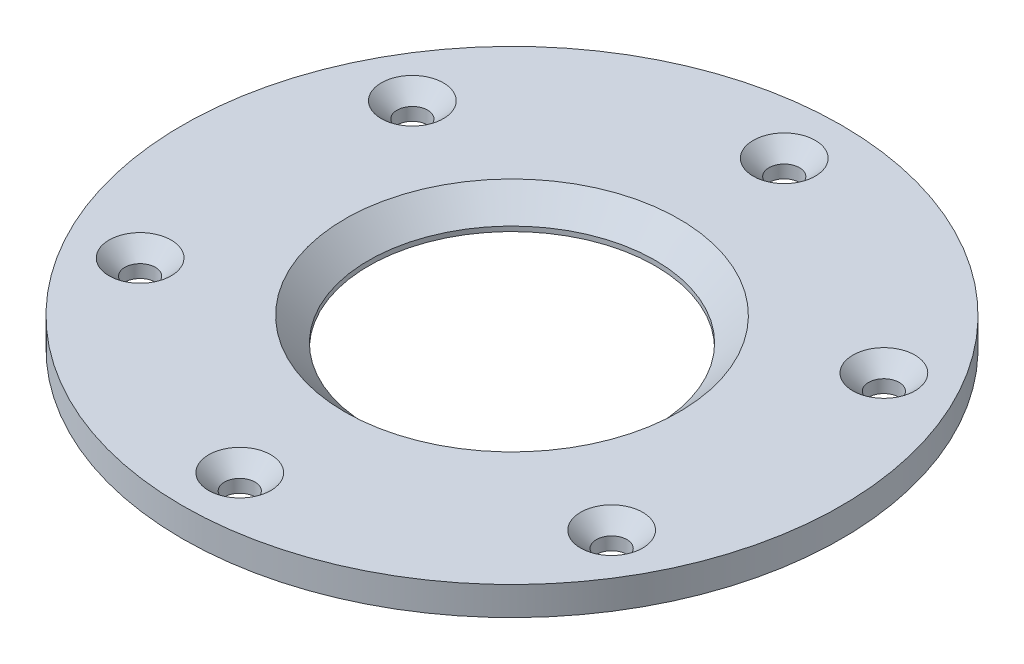
ISO-10303-21;
HEADER;
FILE_DESCRIPTION(('STEP AP214'),'2;1');
FILE_NAME('part.step','',(''),(''),'','','');
FILE_SCHEMA(('AUTOMOTIVE_DESIGN { 1 0 10303 214 1 1 1 1 }'));
ENDSEC;
DATA;
#1=APPLICATION_CONTEXT('core data for automotive mechanical design processes');
#2=APPLICATION_PROTOCOL_DEFINITION('international standard','automotive_design',2000,#1);
#3=PRODUCT_CONTEXT('',#1,'mechanical');
#4=PRODUCT('Part','Part','',(#3));
#5=PRODUCT_RELATED_PRODUCT_CATEGORY('part','',(#4));
#6=PRODUCT_DEFINITION_FORMATION('','',#4);
#7=PRODUCT_DEFINITION_CONTEXT('part definition',#1,'design');
#8=PRODUCT_DEFINITION('design','',#6,#7);
#9=PRODUCT_DEFINITION_SHAPE('','',#8);
#10=(LENGTH_UNIT() NAMED_UNIT(*) SI_UNIT(.MILLI.,.METRE.));
#11=(NAMED_UNIT(*) PLANE_ANGLE_UNIT() SI_UNIT($,.RADIAN.));
#12=(NAMED_UNIT(*) SI_UNIT($,.STERADIAN.) SOLID_ANGLE_UNIT());
#13=UNCERTAINTY_MEASURE_WITH_UNIT(LENGTH_MEASURE(1.E-05),#10,'distance_accuracy_value','');
#14=(GEOMETRIC_REPRESENTATION_CONTEXT(3) GLOBAL_UNCERTAINTY_ASSIGNED_CONTEXT((#13)) GLOBAL_UNIT_ASSIGNED_CONTEXT((#10,
#11,#12)) REPRESENTATION_CONTEXT('',''));
#15=CARTESIAN_POINT('',(0.,0.,0.));
#16=DIRECTION('',(0.,0.,1.));
#17=DIRECTION('',(1.,0.,0.));
#18=AXIS2_PLACEMENT_3D('',#15,#16,#17);
#19=CARTESIAN_POINT('',(0.,1.51000000000001,0.));
#20=DIRECTION('',(0.,1.,0.));
#21=DIRECTION('',(0.,0.,1.));
#22=AXIS2_PLACEMENT_3D('',#19,#20,#21);
#23=PLANE('',#22);
#24=CARTESIAN_POINT('',(0.,1.51000000000001,0.));
#25=DIRECTION('',(0.,1.,0.));
#26=DIRECTION('',(0.,0.,1.));
#27=AXIS2_PLACEMENT_3D('',#24,#25,#26);
#28=CIRCLE('',#27,17.5);
#29=CARTESIAN_POINT('',(0.,1.51000000000001,17.5));
#30=VERTEX_POINT('',#29);
#31=EDGE_CURVE('E20',#30,#30,#28,.F.);
#32=ORIENTED_EDGE('',*,*,#31,.F.);
#33=EDGE_LOOP('',(#32));
#34=FACE_BOUND('',#33,.T.);
#35=CARTESIAN_POINT('',(0.,1.51000000000001,0.));
#36=DIRECTION('',(0.,1.,0.));
#37=DIRECTION('',(0.,0.,1.));
#38=AXIS2_PLACEMENT_3D('',#35,#36,#37);
#39=CIRCLE('',#38,19.95);
#40=CARTESIAN_POINT('',(0.,1.51000000000001,19.95));
#41=VERTEX_POINT('',#40);
#42=EDGE_CURVE('E212',#41,#41,#39,.F.);
#43=ORIENTED_EDGE('',*,*,#42,.T.);
#44=EDGE_LOOP('',(#43));
#45=FACE_BOUND('',#44,.T.);
#46=ADVANCED_FACE('F17',(#34,#45),#23,.F.);
#47=CARTESIAN_POINT('',(0.,0.,0.));
#48=DIRECTION('',(0.,1.,0.));
#49=DIRECTION('',(0.,0.,1.));
#50=AXIS2_PLACEMENT_3D('',#47,#48,#49);
#51=CYLINDRICAL_SURFACE('',#50,17.5);
#52=CARTESIAN_POINT('',(0.,0.,0.));
#53=DIRECTION('',(0.,1.,0.));
#54=DIRECTION('',(0.,0.,1.));
#55=AXIS2_PLACEMENT_3D('',#52,#53,#54);
#56=CIRCLE('',#55,17.5);
#57=CARTESIAN_POINT('',(0.,0.,17.5));
#58=VERTEX_POINT('',#57);
#59=EDGE_CURVE('E208',#58,#58,#56,.F.);
#60=ORIENTED_EDGE('',*,*,#59,.F.);
#61=EDGE_LOOP('',(#60));
#62=FACE_BOUND('',#61,.T.);
#63=ORIENTED_EDGE('',*,*,#31,.T.);
#64=EDGE_LOOP('',(#63));
#65=FACE_BOUND('',#64,.T.);
#66=ADVANCED_FACE('F198',(#62,#65),#51,.T.);
#67=CARTESIAN_POINT('',(0.,0.,0.));
#68=DIRECTION('',(0.,1.,0.));
#69=DIRECTION('',(0.,0.,1.));
#70=AXIS2_PLACEMENT_3D('',#67,#68,#69);
#71=CYLINDRICAL_SURFACE('',#70,19.95);
#72=CARTESIAN_POINT('',(0.,0.,0.));
#73=DIRECTION('',(0.,1.,0.));
#74=DIRECTION('',(0.,0.,1.));
#75=AXIS2_PLACEMENT_3D('',#72,#73,#74);
#76=CIRCLE('',#75,19.95);
#77=CARTESIAN_POINT('',(0.,0.,19.95));
#78=VERTEX_POINT('',#77);
#79=EDGE_CURVE('E104',#78,#78,#76,.T.);
#80=ORIENTED_EDGE('',*,*,#79,.F.);
#81=EDGE_LOOP('',(#80));
#82=FACE_BOUND('',#81,.T.);
#83=ORIENTED_EDGE('',*,*,#42,.F.);
#84=EDGE_LOOP('',(#83));
#85=FACE_BOUND('',#84,.T.);
#86=ADVANCED_FACE('F190',(#82,#85),#71,.F.);
#87=CARTESIAN_POINT('',(24.75,0.,0.));
#88=DIRECTION('',(0.,-1.,0.));
#89=DIRECTION('',(0.,0.,-1.));
#90=AXIS2_PLACEMENT_3D('',#87,#88,#89);
#91=PLANE('',#90);
#92=CARTESIAN_POINT('',(0.,0.,0.));
#93=DIRECTION('',(0.,-1.,0.));
#94=DIRECTION('',(0.,0.,-1.));
#95=AXIS2_PLACEMENT_3D('',#92,#93,#94);
#96=CIRCLE('',#95,15.);
#97=CARTESIAN_POINT('',(0.,0.,-15.));
#98=VERTEX_POINT('',#97);
#99=EDGE_CURVE('E69',#98,#98,#96,.F.);
#100=ORIENTED_EDGE('',*,*,#99,.T.);
#101=EDGE_LOOP('',(#100));
#102=FACE_BOUND('',#101,.T.);
#103=ORIENTED_EDGE('',*,*,#59,.T.);
#104=EDGE_LOOP('',(#103));
#105=FACE_BOUND('',#104,.T.);
#106=ADVANCED_FACE('F181',(#102,#105),#91,.T.);
#107=CARTESIAN_POINT('',(24.75,0.,0.));
#108=DIRECTION('',(0.,-1.,0.));
#109=DIRECTION('',(0.,0.,-1.));
#110=AXIS2_PLACEMENT_3D('',#107,#108,#109);
#111=PLANE('',#110);
#112=ORIENTED_EDGE('',*,*,#79,.T.);
#113=EDGE_LOOP('',(#112));
#114=FACE_BOUND('',#113,.T.);
#115=CARTESIAN_POINT('',(-24.6817240078565,0.,-14.25));
#116=DIRECTION('',(0.,1.,0.));
#117=DIRECTION('',(0.,0.,1.));
#118=AXIS2_PLACEMENT_3D('',#115,#116,#117);
#119=CIRCLE('',#118,1.6);
#120=CARTESIAN_POINT('',(-24.6817240078565,0.,-12.65));
#121=VERTEX_POINT('',#120);
#122=EDGE_CURVE('E99',#121,#121,#119,.T.);
#123=ORIENTED_EDGE('',*,*,#122,.T.);
#124=EDGE_LOOP('',(#123));
#125=FACE_BOUND('',#124,.T.);
#126=CARTESIAN_POINT('',(-24.6817240078565,0.,14.25));
#127=DIRECTION('',(0.,1.,0.));
#128=DIRECTION('',(0.,0.,1.));
#129=AXIS2_PLACEMENT_3D('',#126,#127,#128);
#130=CIRCLE('',#129,1.6);
#131=CARTESIAN_POINT('',(-24.6817240078565,0.,15.85));
#132=VERTEX_POINT('',#131);
#133=EDGE_CURVE('E94',#132,#132,#130,.T.);
#134=ORIENTED_EDGE('',*,*,#133,.T.);
#135=EDGE_LOOP('',(#134));
#136=FACE_BOUND('',#135,.T.);
#137=CARTESIAN_POINT('',(0.,0.,28.5));
#138=DIRECTION('',(0.,1.,0.));
#139=DIRECTION('',(0.,0.,1.));
#140=AXIS2_PLACEMENT_3D('',#137,#138,#139);
#141=CIRCLE('',#140,1.6);
#142=CARTESIAN_POINT('',(0.,0.,30.1));
#143=VERTEX_POINT('',#142);
#144=EDGE_CURVE('E90',#143,#143,#141,.T.);
#145=ORIENTED_EDGE('',*,*,#144,.T.);
#146=EDGE_LOOP('',(#145));
#147=FACE_BOUND('',#146,.T.);
#148=CARTESIAN_POINT('',(24.6817240078565,0.,14.25));
#149=DIRECTION('',(0.,1.,0.));
#150=DIRECTION('',(0.,0.,1.));
#151=AXIS2_PLACEMENT_3D('',#148,#149,#150);
#152=CIRCLE('',#151,1.6);
#153=CARTESIAN_POINT('',(24.6817240078565,0.,15.85));
#154=VERTEX_POINT('',#153);
#155=EDGE_CURVE('E82',#154,#154,#152,.T.);
#156=ORIENTED_EDGE('',*,*,#155,.T.);
#157=EDGE_LOOP('',(#156));
#158=FACE_BOUND('',#157,.T.);
#159=CARTESIAN_POINT('',(24.6817240078565,0.,-14.25));
#160=DIRECTION('',(0.,1.,0.));
#161=DIRECTION('',(0.,0.,1.));
#162=AXIS2_PLACEMENT_3D('',#159,#160,#161);
#163=CIRCLE('',#162,1.6);
#164=CARTESIAN_POINT('',(24.6817240078565,0.,-12.65));
#165=VERTEX_POINT('',#164);
#166=EDGE_CURVE('E77',#165,#165,#163,.T.);
#167=ORIENTED_EDGE('',*,*,#166,.T.);
#168=EDGE_LOOP('',(#167));
#169=FACE_BOUND('',#168,.T.);
#170=CARTESIAN_POINT('',(0.,0.,-28.5));
#171=DIRECTION('',(0.,1.,0.));
#172=DIRECTION('',(0.,0.,1.));
#173=AXIS2_PLACEMENT_3D('',#170,#171,#172);
#174=CIRCLE('',#173,1.6);
#175=CARTESIAN_POINT('',(0.,0.,-26.9));
#176=VERTEX_POINT('',#175);
#177=EDGE_CURVE('E72',#176,#176,#174,.T.);
#178=ORIENTED_EDGE('',*,*,#177,.T.);
#179=EDGE_LOOP('',(#178));
#180=FACE_BOUND('',#179,.T.);
#181=CARTESIAN_POINT('',(0.,0.,0.));
#182=DIRECTION('',(0.,-1.,0.));
#183=DIRECTION('',(0.,0.,-1.));
#184=AXIS2_PLACEMENT_3D('',#181,#182,#183);
#185=CIRCLE('',#184,34.5);
#186=CARTESIAN_POINT('',(0.,0.,-34.5));
#187=VERTEX_POINT('',#186);
#188=EDGE_CURVE('E64',#187,#187,#185,.F.);
#189=ORIENTED_EDGE('',*,*,#188,.F.);
#190=EDGE_LOOP('',(#189));
#191=FACE_BOUND('',#190,.T.);
#192=ADVANCED_FACE('F179',(#114,#125,#136,#147,#158,#169,#180,#191),#111,.T.);
#193=CARTESIAN_POINT('',(-24.6817240078565,-94.6268405716379,-14.25));
#194=DIRECTION('',(0.,1.,0.));
#195=DIRECTION('',(0.,0.,1.));
#196=AXIS2_PLACEMENT_3D('',#193,#194,#195);
#197=CYLINDRICAL_SURFACE('',#196,1.6);
#198=CARTESIAN_POINT('',(-24.6817240078565,1.35000000000218,-14.25));
#199=DIRECTION('',(0.,1.,0.));
#200=DIRECTION('',(0.499999999974687,0.,-0.866025403799053));
#201=AXIS2_PLACEMENT_3D('',#198,#199,#200);
#202=CIRCLE('',#201,1.6000000000364);
#203=CARTESIAN_POINT('',(-23.8817240078788,1.35000000000218,-15.63564064611));
#204=VERTEX_POINT('',#203);
#205=EDGE_CURVE('E68',#204,#204,#202,.T.);
#206=ORIENTED_EDGE('',*,*,#205,.T.);
#207=EDGE_LOOP('',(#206));
#208=FACE_BOUND('',#207,.T.);
#209=ORIENTED_EDGE('',*,*,#122,.F.);
#210=EDGE_LOOP('',(#209));
#211=FACE_BOUND('',#210,.T.);
#212=ADVANCED_FACE('F155',(#208,#211),#197,.F.);
#213=CARTESIAN_POINT('',(-24.6817240078565,-94.6268405716379,14.25));
#214=DIRECTION('',(0.,1.,0.));
#215=DIRECTION('',(0.,0.,1.));
#216=AXIS2_PLACEMENT_3D('',#213,#214,#215);
#217=CYLINDRICAL_SURFACE('',#216,1.6);
#218=CARTESIAN_POINT('',(-24.6817240078565,1.35000000000218,14.25));
#219=DIRECTION('',(0.,1.,0.));
#220=DIRECTION('',(-0.499999999984801,0.,-0.866025403793214));
#221=AXIS2_PLACEMENT_3D('',#218,#219,#220);
#222=CIRCLE('',#221,1.5999999999721);
#223=CARTESIAN_POINT('',(-25.4817240078182,1.35000000000218,12.864359353955));
#224=VERTEX_POINT('',#223);
#225=EDGE_CURVE('E141',#224,#224,#222,.T.);
#226=ORIENTED_EDGE('',*,*,#225,.T.);
#227=EDGE_LOOP('',(#226));
#228=FACE_BOUND('',#227,.T.);
#229=ORIENTED_EDGE('',*,*,#133,.F.);
#230=EDGE_LOOP('',(#229));
#231=FACE_BOUND('',#230,.T.);
#232=ADVANCED_FACE('F188',(#228,#231),#217,.F.);
#233=CARTESIAN_POINT('',(0.,-94.6268405716379,28.5));
#234=DIRECTION('',(0.,1.,0.));
#235=DIRECTION('',(0.,0.,1.));
#236=AXIS2_PLACEMENT_3D('',#233,#234,#235);
#237=CYLINDRICAL_SURFACE('',#236,1.6);
#238=CARTESIAN_POINT('',(0.,1.35000000000218,28.5));
#239=DIRECTION('',(0.,1.,0.));
#240=DIRECTION('',(-1.,0.,0.));
#241=AXIS2_PLACEMENT_3D('',#238,#239,#240);
#242=CIRCLE('',#241,1.59999999993943);
#243=CARTESIAN_POINT('',(-1.59999999993943,1.35000000000218,28.5));
#244=VERTEX_POINT('',#243);
#245=EDGE_CURVE('E137',#244,#244,#242,.T.);
#246=ORIENTED_EDGE('',*,*,#245,.T.);
#247=EDGE_LOOP('',(#246));
#248=FACE_BOUND('',#247,.T.);
#249=ORIENTED_EDGE('',*,*,#144,.F.);
#250=EDGE_LOOP('',(#249));
#251=FACE_BOUND('',#250,.T.);
#252=ADVANCED_FACE('F267',(#248,#251),#237,.F.);
#253=CARTESIAN_POINT('',(24.6817240078565,-94.6268405716379,14.25));
#254=DIRECTION('',(0.,1.,0.));
#255=DIRECTION('',(0.,0.,1.));
#256=AXIS2_PLACEMENT_3D('',#253,#254,#255);
#257=CYLINDRICAL_SURFACE('',#256,1.6);
#258=CARTESIAN_POINT('',(24.6817240078565,1.35000000000218,14.25));
#259=DIRECTION('',(0.,1.,0.));
#260=DIRECTION('',(-0.499999999976748,0.,0.866025403797863));
#261=AXIS2_PLACEMENT_3D('',#258,#259,#260);
#262=CIRCLE('',#261,1.59999999997296);
#263=CARTESIAN_POINT('',(23.8817240079072,1.35000000000218,15.6356406460532));
#264=VERTEX_POINT('',#263);
#265=EDGE_CURVE('E126',#264,#264,#262,.T.);
#266=ORIENTED_EDGE('',*,*,#265,.T.);
#267=EDGE_LOOP('',(#266));
#268=FACE_BOUND('',#267,.T.);
#269=ORIENTED_EDGE('',*,*,#155,.F.);
#270=EDGE_LOOP('',(#269));
#271=FACE_BOUND('',#270,.T.);
#272=ADVANCED_FACE('F229',(#268,#271),#257,.F.);
#273=CARTESIAN_POINT('',(24.6817240078565,-94.6268405716379,-14.25));
#274=DIRECTION('',(0.,1.,0.));
#275=DIRECTION('',(0.,0.,1.));
#276=AXIS2_PLACEMENT_3D('',#273,#274,#275);
#277=CYLINDRICAL_SURFACE('',#276,1.6);
#278=CARTESIAN_POINT('',(24.6817240078565,1.35000000000218,-14.25));
#279=DIRECTION('',(0.,1.,0.));
#280=DIRECTION('',(0.499999999984801,0.,0.866025403793214));
#281=AXIS2_PLACEMENT_3D('',#278,#279,#280);
#282=CIRCLE('',#281,1.5999999999721);
#283=CARTESIAN_POINT('',(25.4817240078182,1.35000000000218,-12.864359353955));
#284=VERTEX_POINT('',#283);
#285=EDGE_CURVE('E119',#284,#284,#282,.T.);
#286=ORIENTED_EDGE('',*,*,#285,.T.);
#287=EDGE_LOOP('',(#286));
#288=FACE_BOUND('',#287,.T.);
#289=ORIENTED_EDGE('',*,*,#166,.F.);
#290=EDGE_LOOP('',(#289));
#291=FACE_BOUND('',#290,.T.);
#292=ADVANCED_FACE('F260',(#288,#291),#277,.F.);
#293=CARTESIAN_POINT('',(0.,-94.6268405716379,-28.5));
#294=DIRECTION('',(0.,1.,0.));
#295=DIRECTION('',(0.,0.,1.));
#296=AXIS2_PLACEMENT_3D('',#293,#294,#295);
#297=CYLINDRICAL_SURFACE('',#296,1.6);
#298=CARTESIAN_POINT('',(0.,1.35000000000218,-28.5));
#299=DIRECTION('',(0.,1.,0.));
#300=DIRECTION('',(1.,0.,0.));
#301=AXIS2_PLACEMENT_3D('',#298,#299,#300);
#302=CIRCLE('',#301,1.59999999993943);
#303=CARTESIAN_POINT('',(1.59999999993943,1.35000000000218,-28.5));
#304=VERTEX_POINT('',#303);
#305=EDGE_CURVE('E116',#304,#304,#302,.T.);
#306=ORIENTED_EDGE('',*,*,#305,.T.);
#307=EDGE_LOOP('',(#306));
#308=FACE_BOUND('',#307,.T.);
#309=ORIENTED_EDGE('',*,*,#177,.F.);
#310=EDGE_LOOP('',(#309));
#311=FACE_BOUND('',#310,.T.);
#312=ADVANCED_FACE('F256',(#308,#311),#297,.F.);
#313=CARTESIAN_POINT('',(0.,0.250000000000014,0.));
#314=DIRECTION('',(0.,-1.,0.));
#315=DIRECTION('',(0.,0.,-1.));
#316=AXIS2_PLACEMENT_3D('',#313,#314,#315);
#317=CYLINDRICAL_SURFACE('',#316,15.);
#318=ORIENTED_EDGE('',*,*,#99,.F.);
#319=EDGE_LOOP('',(#318));
#320=FACE_BOUND('',#319,.T.);
#321=CARTESIAN_POINT('',(0.,0.500000000003201,0.));
#322=DIRECTION('',(0.,1.,0.));
#323=DIRECTION('',(1.,0.,0.));
#324=AXIS2_PLACEMENT_3D('',#321,#322,#323);
#325=CIRCLE('',#324,14.9999999999968);
#326=CARTESIAN_POINT('',(14.9999999999968,0.500000000003201,0.));
#327=VERTEX_POINT('',#326);
#328=EDGE_CURVE('E63',#327,#327,#325,.T.);
#329=ORIENTED_EDGE('',*,*,#328,.T.);
#330=EDGE_LOOP('',(#329));
#331=FACE_BOUND('',#330,.T.);
#332=ADVANCED_FACE('F175',(#320,#331),#317,.F.);
#333=CARTESIAN_POINT('',(0.,1.50000000000001,0.));
#334=DIRECTION('',(0.,-1.,0.));
#335=DIRECTION('',(0.,0.,-1.));
#336=AXIS2_PLACEMENT_3D('',#333,#334,#335);
#337=CYLINDRICAL_SURFACE('',#336,34.5);
#338=CARTESIAN_POINT('',(0.,3.00000000000001,0.));
#339=DIRECTION('',(0.,-1.,0.));
#340=DIRECTION('',(0.,0.,-1.));
#341=AXIS2_PLACEMENT_3D('',#338,#339,#340);
#342=CIRCLE('',#341,34.5);
#343=CARTESIAN_POINT('',(0.,3.00000000000001,-34.5));
#344=VERTEX_POINT('',#343);
#345=EDGE_CURVE('E59',#344,#344,#342,.F.);
#346=ORIENTED_EDGE('',*,*,#345,.F.);
#347=EDGE_LOOP('',(#346));
#348=FACE_BOUND('',#347,.T.);
#349=ORIENTED_EDGE('',*,*,#188,.T.);
#350=EDGE_LOOP('',(#349));
#351=FACE_BOUND('',#350,.T.);
#352=ADVANCED_FACE('F162',(#348,#351),#337,.T.);
#353=CARTESIAN_POINT('',(-24.6817240078565,2.9999999999859,-14.25));
#354=DIRECTION('',(0.,1.,0.));
#355=DIRECTION('',(0.,0.,1.));
#356=AXIS2_PLACEMENT_3D('',#353,#354,#355);
#357=CONICAL_SURFACE('',#356,3.250000000035,0.785398163401957);
#358=ORIENTED_EDGE('',*,*,#205,.F.);
#359=EDGE_LOOP('',(#358));
#360=FACE_BOUND('',#359,.T.);
#361=CARTESIAN_POINT('',(-24.6817240078565,2.9999999999859,-14.25));
#362=DIRECTION('',(0.,1.,0.));
#363=DIRECTION('',(0.,0.,1.));
#364=AXIS2_PLACEMENT_3D('',#361,#362,#363);
#365=CIRCLE('',#364,3.250000000035);
#366=CARTESIAN_POINT('',(-24.6817240078565,2.9999999999859,-10.999999999965));
#367=VERTEX_POINT('',#366);
#368=EDGE_CURVE('E55',#367,#367,#365,.F.);
#369=ORIENTED_EDGE('',*,*,#368,.F.);
#370=EDGE_LOOP('',(#369));
#371=FACE_BOUND('',#370,.T.);
#372=ADVANCED_FACE('F158',(#360,#371),#357,.F.);
#373=CARTESIAN_POINT('',(-24.6817240078565,2.9999999999859,14.25));
#374=DIRECTION('',(0.,1.,0.));
#375=DIRECTION('',(0.,0.,1.));
#376=AXIS2_PLACEMENT_3D('',#373,#374,#375);
#377=CONICAL_SURFACE('',#376,3.24999999995649,0.785398163397651);
#378=ORIENTED_EDGE('',*,*,#225,.F.);
#379=EDGE_LOOP('',(#378));
#380=FACE_BOUND('',#379,.T.);
#381=CARTESIAN_POINT('',(-24.6817240078565,2.9999999999859,14.25));
#382=DIRECTION('',(0.,1.,0.));
#383=DIRECTION('',(0.,0.,1.));
#384=AXIS2_PLACEMENT_3D('',#381,#382,#383);
#385=CIRCLE('',#384,3.24999999995649);
#386=CARTESIAN_POINT('',(-24.6817240078565,2.9999999999859,17.4999999999565));
#387=VERTEX_POINT('',#386);
#388=EDGE_CURVE('E51',#387,#387,#385,.F.);
#389=ORIENTED_EDGE('',*,*,#388,.F.);
#390=EDGE_LOOP('',(#389));
#391=FACE_BOUND('',#390,.T.);
#392=ADVANCED_FACE('F161',(#380,#391),#377,.F.);
#393=CARTESIAN_POINT('',(0.,2.9999999999859,28.5));
#394=DIRECTION('',(0.,1.,0.));
#395=DIRECTION('',(0.,0.,1.));
#396=AXIS2_PLACEMENT_3D('',#393,#394,#395);
#397=CONICAL_SURFACE('',#396,3.24999999998,0.785398163414674);
#398=ORIENTED_EDGE('',*,*,#245,.F.);
#399=EDGE_LOOP('',(#398));
#400=FACE_BOUND('',#399,.T.);
#401=CARTESIAN_POINT('',(0.,2.9999999999859,28.5));
#402=DIRECTION('',(0.,1.,0.));
#403=DIRECTION('',(0.,0.,1.));
#404=AXIS2_PLACEMENT_3D('',#401,#402,#403);
#405=CIRCLE('',#404,3.24999999998);
#406=CARTESIAN_POINT('',(0.,2.9999999999859,31.74999999998));
#407=VERTEX_POINT('',#406);
#408=EDGE_CURVE('E47',#407,#407,#405,.F.);
#409=ORIENTED_EDGE('',*,*,#408,.F.);
#410=EDGE_LOOP('',(#409));
#411=FACE_BOUND('',#410,.T.);
#412=ADVANCED_FACE('F236',(#400,#411),#397,.F.);
#413=CARTESIAN_POINT('',(24.6817240078565,2.99999999987222,14.25));
#414=DIRECTION('',(0.,1.,0.));
#415=DIRECTION('',(-1.,0.,0.));
#416=AXIS2_PLACEMENT_3D('',#413,#414,#415);
#417=CONICAL_SURFACE('',#416,3.24999999989391,0.78539816339965);
#418=ORIENTED_EDGE('',*,*,#265,.F.);
#419=EDGE_LOOP('',(#418));
#420=FACE_BOUND('',#419,.T.);
#421=CARTESIAN_POINT('',(24.6817240078565,2.99999999994987,14.25));
#422=DIRECTION('',(0.,1.,0.));
#423=DIRECTION('',(-1.,0.,0.));
#424=AXIS2_PLACEMENT_3D('',#421,#422,#423);
#425=CIRCLE('',#424,3.24999999997156);
#426=CARTESIAN_POINT('',(21.4317240078849,2.99999999994987,14.25));
#427=VERTEX_POINT('',#426);
#428=EDGE_CURVE('E43',#427,#427,#425,.F.);
#429=ORIENTED_EDGE('',*,*,#428,.F.);
#430=EDGE_LOOP('',(#429));
#431=FACE_BOUND('',#430,.T.);
#432=ADVANCED_FACE('F232',(#420,#431),#417,.F.);
#433=CARTESIAN_POINT('',(24.6817240078565,2.99999999987222,-14.25));
#434=DIRECTION('',(0.,1.,0.));
#435=DIRECTION('',(-1.,0.,0.));
#436=AXIS2_PLACEMENT_3D('',#433,#434,#435);
#437=CONICAL_SURFACE('',#436,3.24999999989305,0.785398163399649);
#438=ORIENTED_EDGE('',*,*,#285,.F.);
#439=EDGE_LOOP('',(#438));
#440=FACE_BOUND('',#439,.T.);
#441=CARTESIAN_POINT('',(24.6817240078565,2.99999999994987,-14.25));
#442=DIRECTION('',(0.,1.,0.));
#443=DIRECTION('',(-1.,0.,0.));
#444=AXIS2_PLACEMENT_3D('',#441,#442,#443);
#445=CIRCLE('',#444,3.2499999999707);
#446=CARTESIAN_POINT('',(21.4317240078858,2.99999999994987,-14.25));
#447=VERTEX_POINT('',#446);
#448=EDGE_CURVE('E34',#447,#447,#445,.F.);
#449=ORIENTED_EDGE('',*,*,#448,.F.);
#450=EDGE_LOOP('',(#449));
#451=FACE_BOUND('',#450,.T.);
#452=ADVANCED_FACE('F235',(#440,#451),#437,.F.);
#453=CARTESIAN_POINT('',(0.,2.9999999999859,-28.5));
#454=DIRECTION('',(0.,1.,0.));
#455=DIRECTION('',(0.,0.,1.));
#456=AXIS2_PLACEMENT_3D('',#453,#454,#455);
#457=CONICAL_SURFACE('',#456,3.24999999997999,0.785398163414674);
#458=ORIENTED_EDGE('',*,*,#305,.F.);
#459=EDGE_LOOP('',(#458));
#460=FACE_BOUND('',#459,.T.);
#461=CARTESIAN_POINT('',(0.,2.9999999999859,-28.5));
#462=DIRECTION('',(0.,1.,0.));
#463=DIRECTION('',(0.,0.,1.));
#464=AXIS2_PLACEMENT_3D('',#461,#462,#463);
#465=CIRCLE('',#464,3.24999999997999);
#466=CARTESIAN_POINT('',(0.,2.9999999999859,-25.25000000002));
#467=VERTEX_POINT('',#466);
#468=EDGE_CURVE('E25',#467,#467,#465,.F.);
#469=ORIENTED_EDGE('',*,*,#468,.F.);
#470=EDGE_LOOP('',(#469));
#471=FACE_BOUND('',#470,.T.);
#472=ADVANCED_FACE('F339',(#460,#471),#457,.F.);
#473=CARTESIAN_POINT('',(0.,2.99999999999682,0.));
#474=DIRECTION('',(0.,1.,0.));
#475=DIRECTION('',(0.,0.,1.));
#476=AXIS2_PLACEMENT_3D('',#473,#474,#475);
#477=CONICAL_SURFACE('',#476,17.5000000000032,0.7853981634);
#478=ORIENTED_EDGE('',*,*,#328,.F.);
#479=EDGE_LOOP('',(#478));
#480=FACE_BOUND('',#479,.T.);
#481=CARTESIAN_POINT('',(0.,2.99999999999682,0.));
#482=DIRECTION('',(0.,1.,0.));
#483=DIRECTION('',(0.,0.,1.));
#484=AXIS2_PLACEMENT_3D('',#481,#482,#483);
#485=CIRCLE('',#484,17.5000000000032);
#486=CARTESIAN_POINT('',(0.,2.99999999999682,17.5000000000032));
#487=VERTEX_POINT('',#486);
#488=EDGE_CURVE('E11',#487,#487,#485,.F.);
#489=ORIENTED_EDGE('',*,*,#488,.F.);
#490=EDGE_LOOP('',(#489));
#491=FACE_BOUND('',#490,.T.);
#492=ADVANCED_FACE('F169',(#480,#491),#477,.F.);
#493=CARTESIAN_POINT('',(26.,3.00000000000001,0.));
#494=DIRECTION('',(0.,1.,0.));
#495=DIRECTION('',(0.,0.,1.));
#496=AXIS2_PLACEMENT_3D('',#493,#494,#495);
#497=PLANE('',#496);
#498=ORIENTED_EDGE('',*,*,#488,.T.);
#499=EDGE_LOOP('',(#498));
#500=FACE_BOUND('',#499,.T.);
#501=ORIENTED_EDGE('',*,*,#468,.T.);
#502=EDGE_LOOP('',(#501));
#503=FACE_BOUND('',#502,.T.);
#504=ORIENTED_EDGE('',*,*,#448,.T.);
#505=EDGE_LOOP('',(#504));
#506=FACE_BOUND('',#505,.T.);
#507=ORIENTED_EDGE('',*,*,#428,.T.);
#508=EDGE_LOOP('',(#507));
#509=FACE_BOUND('',#508,.T.);
#510=ORIENTED_EDGE('',*,*,#408,.T.);
#511=EDGE_LOOP('',(#510));
#512=FACE_BOUND('',#511,.T.);
#513=ORIENTED_EDGE('',*,*,#388,.T.);
#514=EDGE_LOOP('',(#513));
#515=FACE_BOUND('',#514,.T.);
#516=ORIENTED_EDGE('',*,*,#368,.T.);
#517=EDGE_LOOP('',(#516));
#518=FACE_BOUND('',#517,.T.);
#519=ORIENTED_EDGE('',*,*,#345,.T.);
#520=EDGE_LOOP('',(#519));
#521=FACE_BOUND('',#520,.T.);
#522=ADVANCED_FACE('F166',(#500,#503,#506,#509,#512,#515,#518,#521),#497,.T.);
#523=CLOSED_SHELL('',(#46,#66,#86,#106,#192,#212,#232,#252,#272,#292,#312,#332,#352,#372,#392,
#412,#432,#452,#472,#492,#522));
#524=MANIFOLD_SOLID_BREP('B1',#523);
#525=ADVANCED_BREP_SHAPE_REPRESENTATION('',(#18,#524),#14);
#526=SHAPE_DEFINITION_REPRESENTATION(#9,#525);
ENDSEC;
END-ISO-10303-21;
